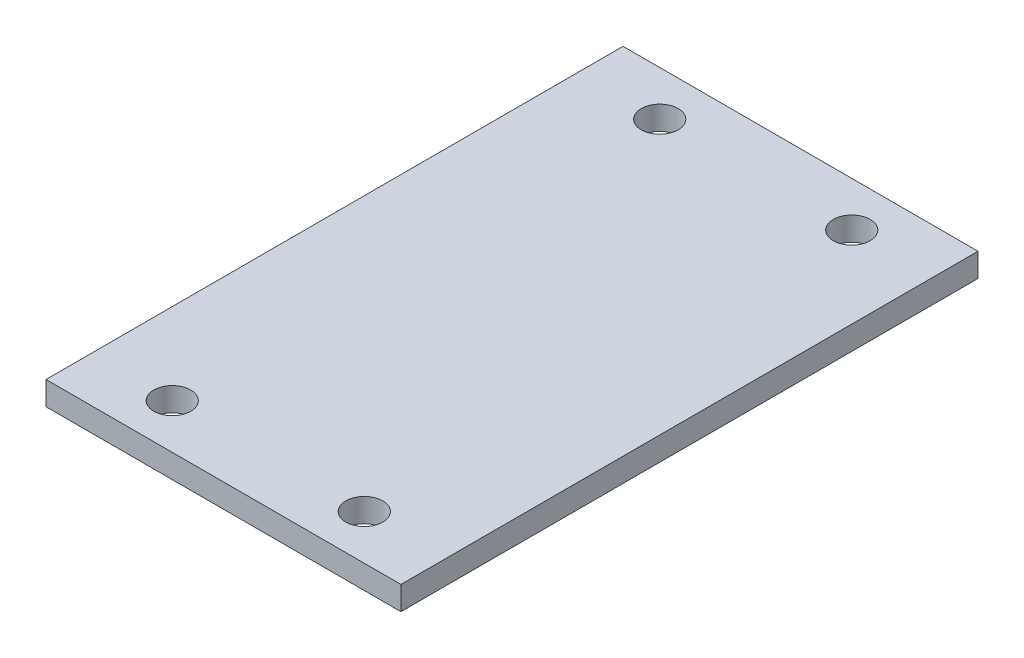
ISO-10303-21;
HEADER;
FILE_DESCRIPTION(('STEP AP214'),'2;1');
FILE_NAME('part.step','',(''),(''),'','','');
FILE_SCHEMA(('AUTOMOTIVE_DESIGN { 1 0 10303 214 1 1 1 1 }'));
ENDSEC;
DATA;
#1=APPLICATION_CONTEXT('core data for automotive mechanical design processes');
#2=APPLICATION_PROTOCOL_DEFINITION('international standard','automotive_design',2000,#1);
#3=PRODUCT_CONTEXT('',#1,'mechanical');
#4=PRODUCT('Part','Part','',(#3));
#5=PRODUCT_RELATED_PRODUCT_CATEGORY('part','',(#4));
#6=PRODUCT_DEFINITION_FORMATION('','',#4);
#7=PRODUCT_DEFINITION_CONTEXT('part definition',#1,'design');
#8=PRODUCT_DEFINITION('design','',#6,#7);
#9=PRODUCT_DEFINITION_SHAPE('','',#8);
#10=(LENGTH_UNIT() NAMED_UNIT(*) SI_UNIT(.MILLI.,.METRE.));
#11=(NAMED_UNIT(*) PLANE_ANGLE_UNIT() SI_UNIT($,.RADIAN.));
#12=(NAMED_UNIT(*) SI_UNIT($,.STERADIAN.) SOLID_ANGLE_UNIT());
#13=UNCERTAINTY_MEASURE_WITH_UNIT(LENGTH_MEASURE(1.E-05),#10,'distance_accuracy_value','');
#14=(GEOMETRIC_REPRESENTATION_CONTEXT(3) GLOBAL_UNCERTAINTY_ASSIGNED_CONTEXT((#13)) GLOBAL_UNIT_ASSIGNED_CONTEXT((#10,
#11,#12)) REPRESENTATION_CONTEXT('',''));
#15=CARTESIAN_POINT('',(0.,0.,0.));
#16=DIRECTION('',(0.,0.,1.));
#17=DIRECTION('',(1.,0.,0.));
#18=AXIS2_PLACEMENT_3D('',#15,#16,#17);
#19=CARTESIAN_POINT('',(0.,1.6,0.));
#20=DIRECTION('',(0.,-1.,0.));
#21=DIRECTION('',(0.,0.,-1.));
#22=AXIS2_PLACEMENT_3D('',#19,#20,#21);
#23=PLANE('',#22);
#24=DIRECTION('',(0.,0.,1.));
#25=VECTOR('',#24,1.);
#26=CARTESIAN_POINT('',(0.,1.6,0.));
#27=LINE('',#26,#25);
#28=CARTESIAN_POINT('',(0.,1.6,-39.0652));
#29=VERTEX_POINT('',#28);
#30=CARTESIAN_POINT('',(0.,1.6,0.));
#31=VERTEX_POINT('',#30);
#32=EDGE_CURVE('E88',#29,#31,#27,.T.);
#33=ORIENTED_EDGE('',*,*,#32,.T.);
#34=DIRECTION('',(1.,0.,0.));
#35=VECTOR('',#34,1.);
#36=CARTESIAN_POINT('',(0.,1.6,0.));
#37=LINE('',#36,#35);
#38=CARTESIAN_POINT('',(24.0284,1.6,0.));
#39=VERTEX_POINT('',#38);
#40=EDGE_CURVE('E83',#31,#39,#37,.T.);
#41=ORIENTED_EDGE('',*,*,#40,.T.);
#42=DIRECTION('',(0.,0.,-1.));
#43=VECTOR('',#42,1.);
#44=CARTESIAN_POINT('',(24.0284,1.6,0.));
#45=LINE('',#44,#43);
#46=CARTESIAN_POINT('',(24.0284,1.6,-39.0652));
#47=VERTEX_POINT('',#46);
#48=EDGE_CURVE('E86',#39,#47,#45,.T.);
#49=ORIENTED_EDGE('',*,*,#48,.T.);
#50=DIRECTION('',(-1.,0.,0.));
#51=VECTOR('',#50,1.);
#52=CARTESIAN_POINT('',(0.,1.6,-39.0652));
#53=LINE('',#52,#51);
#54=EDGE_CURVE('E53',#47,#29,#53,.T.);
#55=ORIENTED_EDGE('',*,*,#54,.T.);
#56=EDGE_LOOP('',(#33,#41,#49,#55));
#57=FACE_BOUND('',#56,.T.);
#58=CARTESIAN_POINT('',(5.51420000000001,1.6,-36.0326));
#59=DIRECTION('',(0.,1.,0.));
#60=DIRECTION('',(0.,0.,1.));
#61=AXIS2_PLACEMENT_3D('',#58,#59,#60);
#62=CIRCLE('',#61,1.25);
#63=CARTESIAN_POINT('',(5.51420000000001,1.6,-34.7826));
#64=VERTEX_POINT('',#63);
#65=EDGE_CURVE('E103',#64,#64,#62,.T.);
#66=ORIENTED_EDGE('',*,*,#65,.F.);
#67=EDGE_LOOP('',(#66));
#68=FACE_BOUND('',#67,.T.);
#69=CARTESIAN_POINT('',(5.5142,1.6,-3.0326));
#70=DIRECTION('',(0.,1.,0.));
#71=DIRECTION('',(0.,0.,1.));
#72=AXIS2_PLACEMENT_3D('',#69,#70,#71);
#73=CIRCLE('',#72,1.25);
#74=CARTESIAN_POINT('',(5.5142,1.6,-1.78260000000001));
#75=VERTEX_POINT('',#74);
#76=EDGE_CURVE('E118',#75,#75,#73,.T.);
#77=ORIENTED_EDGE('',*,*,#76,.F.);
#78=EDGE_LOOP('',(#77));
#79=FACE_BOUND('',#78,.T.);
#80=CARTESIAN_POINT('',(18.5142,1.6,-36.0326));
#81=DIRECTION('',(0.,1.,0.));
#82=DIRECTION('',(0.,0.,1.));
#83=AXIS2_PLACEMENT_3D('',#80,#81,#82);
#84=CIRCLE('',#83,1.25);
#85=CARTESIAN_POINT('',(18.5142,1.6,-34.7826));
#86=VERTEX_POINT('',#85);
#87=EDGE_CURVE('E124',#86,#86,#84,.T.);
#88=ORIENTED_EDGE('',*,*,#87,.F.);
#89=EDGE_LOOP('',(#88));
#90=FACE_BOUND('',#89,.T.);
#91=CARTESIAN_POINT('',(18.5142,1.6,-3.0326));
#92=DIRECTION('',(0.,1.,0.));
#93=DIRECTION('',(0.,0.,1.));
#94=AXIS2_PLACEMENT_3D('',#91,#92,#93);
#95=CIRCLE('',#94,1.25);
#96=CARTESIAN_POINT('',(18.5142,1.6,-1.7826));
#97=VERTEX_POINT('',#96);
#98=EDGE_CURVE('E130',#97,#97,#95,.T.);
#99=ORIENTED_EDGE('',*,*,#98,.F.);
#100=EDGE_LOOP('',(#99));
#101=FACE_BOUND('',#100,.T.);
#102=ADVANCED_FACE('F36',(#57,#68,#79,#90,#101),#23,.F.);
#103=CARTESIAN_POINT('',(0.,0.,0.));
#104=DIRECTION('',(0.,-1.,0.));
#105=DIRECTION('',(0.,0.,-1.));
#106=AXIS2_PLACEMENT_3D('',#103,#104,#105);
#107=PLANE('',#106);
#108=CARTESIAN_POINT('',(18.5142,0.,-36.0326));
#109=DIRECTION('',(0.,1.,0.));
#110=DIRECTION('',(0.,0.,1.));
#111=AXIS2_PLACEMENT_3D('',#108,#109,#110);
#112=CIRCLE('',#111,1.25);
#113=CARTESIAN_POINT('',(18.5142,0.,-34.7826));
#114=VERTEX_POINT('',#113);
#115=EDGE_CURVE('E127',#114,#114,#112,.T.);
#116=ORIENTED_EDGE('',*,*,#115,.T.);
#117=EDGE_LOOP('',(#116));
#118=FACE_BOUND('',#117,.T.);
#119=CARTESIAN_POINT('',(5.51420000000001,0.,-36.0326));
#120=DIRECTION('',(0.,1.,0.));
#121=DIRECTION('',(0.,0.,1.));
#122=AXIS2_PLACEMENT_3D('',#119,#120,#121);
#123=CIRCLE('',#122,1.25);
#124=CARTESIAN_POINT('',(5.51420000000001,0.,-34.7826));
#125=VERTEX_POINT('',#124);
#126=EDGE_CURVE('E115',#125,#125,#123,.T.);
#127=ORIENTED_EDGE('',*,*,#126,.T.);
#128=EDGE_LOOP('',(#127));
#129=FACE_BOUND('',#128,.T.);
#130=DIRECTION('',(0.,0.,1.));
#131=VECTOR('',#130,1.);
#132=CARTESIAN_POINT('',(0.,0.,0.));
#133=LINE('',#132,#131);
#134=CARTESIAN_POINT('',(0.,0.,-39.0652));
#135=VERTEX_POINT('',#134);
#136=CARTESIAN_POINT('',(0.,0.,0.));
#137=VERTEX_POINT('',#136);
#138=EDGE_CURVE('E100',#135,#137,#133,.T.);
#139=ORIENTED_EDGE('',*,*,#138,.F.);
#140=DIRECTION('',(-1.,0.,0.));
#141=VECTOR('',#140,1.);
#142=CARTESIAN_POINT('',(0.,0.,-39.0652));
#143=LINE('',#142,#141);
#144=CARTESIAN_POINT('',(24.0284,0.,-39.0652));
#145=VERTEX_POINT('',#144);
#146=EDGE_CURVE('E76',#145,#135,#143,.T.);
#147=ORIENTED_EDGE('',*,*,#146,.F.);
#148=DIRECTION('',(0.,0.,-1.));
#149=VECTOR('',#148,1.);
#150=CARTESIAN_POINT('',(24.0284,0.,0.));
#151=LINE('',#150,#149);
#152=CARTESIAN_POINT('',(24.0284,0.,0.));
#153=VERTEX_POINT('',#152);
#154=EDGE_CURVE('E70',#153,#145,#151,.T.);
#155=ORIENTED_EDGE('',*,*,#154,.F.);
#156=DIRECTION('',(1.,0.,0.));
#157=VECTOR('',#156,1.);
#158=CARTESIAN_POINT('',(0.,0.,0.));
#159=LINE('',#158,#157);
#160=EDGE_CURVE('E92',#137,#153,#159,.T.);
#161=ORIENTED_EDGE('',*,*,#160,.F.);
#162=EDGE_LOOP('',(#139,#147,#155,#161));
#163=FACE_BOUND('',#162,.T.);
#164=CARTESIAN_POINT('',(5.5142,0.,-3.0326));
#165=DIRECTION('',(0.,1.,0.));
#166=DIRECTION('',(0.,0.,1.));
#167=AXIS2_PLACEMENT_3D('',#164,#165,#166);
#168=CIRCLE('',#167,1.25);
#169=CARTESIAN_POINT('',(5.5142,0.,-1.78260000000001));
#170=VERTEX_POINT('',#169);
#171=EDGE_CURVE('E121',#170,#170,#168,.T.);
#172=ORIENTED_EDGE('',*,*,#171,.T.);
#173=EDGE_LOOP('',(#172));
#174=FACE_BOUND('',#173,.T.);
#175=CARTESIAN_POINT('',(18.5142,0.,-3.0326));
#176=DIRECTION('',(0.,1.,0.));
#177=DIRECTION('',(0.,0.,1.));
#178=AXIS2_PLACEMENT_3D('',#175,#176,#177);
#179=CIRCLE('',#178,1.25);
#180=CARTESIAN_POINT('',(18.5142,0.,-1.7826));
#181=VERTEX_POINT('',#180);
#182=EDGE_CURVE('E133',#181,#181,#179,.T.);
#183=ORIENTED_EDGE('',*,*,#182,.T.);
#184=EDGE_LOOP('',(#183));
#185=FACE_BOUND('',#184,.T.);
#186=ADVANCED_FACE('F111',(#118,#129,#163,#174,#185),#107,.T.);
#187=CARTESIAN_POINT('',(0.,1.6,0.));
#188=DIRECTION('',(1.,0.,0.));
#189=DIRECTION('',(0.,0.,-1.));
#190=AXIS2_PLACEMENT_3D('',#187,#188,#189);
#191=PLANE('',#190);
#192=ORIENTED_EDGE('',*,*,#138,.T.);
#193=DIRECTION('',(0.,-1.,0.));
#194=VECTOR('',#193,1.);
#195=CARTESIAN_POINT('',(0.,1.6,0.));
#196=LINE('',#195,#194);
#197=EDGE_CURVE('E11',#31,#137,#196,.T.);
#198=ORIENTED_EDGE('',*,*,#197,.F.);
#199=ORIENTED_EDGE('',*,*,#32,.F.);
#200=DIRECTION('',(0.,-1.,0.));
#201=VECTOR('',#200,1.);
#202=CARTESIAN_POINT('',(0.,1.6,-39.0652));
#203=LINE('',#202,#201);
#204=EDGE_CURVE('E96',#29,#135,#203,.T.);
#205=ORIENTED_EDGE('',*,*,#204,.T.);
#206=EDGE_LOOP('',(#192,#198,#199,#205));
#207=FACE_BOUND('',#206,.T.);
#208=ADVANCED_FACE('F38',(#207),#191,.F.);
#209=CARTESIAN_POINT('',(0.,1.6,0.));
#210=DIRECTION('',(0.,0.,-1.));
#211=DIRECTION('',(-1.,0.,0.));
#212=AXIS2_PLACEMENT_3D('',#209,#210,#211);
#213=PLANE('',#212);
#214=ORIENTED_EDGE('',*,*,#160,.T.);
#215=DIRECTION('',(0.,-1.,0.));
#216=VECTOR('',#215,1.);
#217=CARTESIAN_POINT('',(24.0284,1.6,0.));
#218=LINE('',#217,#216);
#219=EDGE_CURVE('E45',#39,#153,#218,.T.);
#220=ORIENTED_EDGE('',*,*,#219,.F.);
#221=ORIENTED_EDGE('',*,*,#40,.F.);
#222=ORIENTED_EDGE('',*,*,#197,.T.);
#223=EDGE_LOOP('',(#214,#220,#221,#222));
#224=FACE_BOUND('',#223,.T.);
#225=ADVANCED_FACE('F91',(#224),#213,.F.);
#226=CARTESIAN_POINT('',(24.0284,1.6,0.));
#227=DIRECTION('',(-1.,0.,0.));
#228=DIRECTION('',(0.,0.,1.));
#229=AXIS2_PLACEMENT_3D('',#226,#227,#228);
#230=PLANE('',#229);
#231=ORIENTED_EDGE('',*,*,#154,.T.);
#232=DIRECTION('',(0.,-1.,0.));
#233=VECTOR('',#232,1.);
#234=CARTESIAN_POINT('',(24.0284,1.6,-39.0652));
#235=LINE('',#234,#233);
#236=EDGE_CURVE('E93',#47,#145,#235,.T.);
#237=ORIENTED_EDGE('',*,*,#236,.F.);
#238=ORIENTED_EDGE('',*,*,#48,.F.);
#239=ORIENTED_EDGE('',*,*,#219,.T.);
#240=EDGE_LOOP('',(#231,#237,#238,#239));
#241=FACE_BOUND('',#240,.T.);
#242=ADVANCED_FACE('F94',(#241),#230,.F.);
#243=CARTESIAN_POINT('',(0.,1.6,-39.0652));
#244=DIRECTION('',(0.,0.,1.));
#245=DIRECTION('',(1.,0.,0.));
#246=AXIS2_PLACEMENT_3D('',#243,#244,#245);
#247=PLANE('',#246);
#248=ORIENTED_EDGE('',*,*,#146,.T.);
#249=ORIENTED_EDGE('',*,*,#204,.F.);
#250=ORIENTED_EDGE('',*,*,#54,.F.);
#251=ORIENTED_EDGE('',*,*,#236,.T.);
#252=EDGE_LOOP('',(#248,#249,#250,#251));
#253=FACE_BOUND('',#252,.T.);
#254=ADVANCED_FACE('F108',(#253),#247,.F.);
#255=CARTESIAN_POINT('',(5.51420000000001,1.6,-36.0326));
#256=DIRECTION('',(0.,-1.,0.));
#257=DIRECTION('',(0.,0.,-1.));
#258=AXIS2_PLACEMENT_3D('',#255,#256,#257);
#259=CYLINDRICAL_SURFACE('',#258,1.25);
#260=ORIENTED_EDGE('',*,*,#65,.T.);
#261=EDGE_LOOP('',(#260));
#262=FACE_BOUND('',#261,.T.);
#263=ORIENTED_EDGE('',*,*,#126,.F.);
#264=EDGE_LOOP('',(#263));
#265=FACE_BOUND('',#264,.T.);
#266=ADVANCED_FACE('F150',(#262,#265),#259,.F.);
#267=CARTESIAN_POINT('',(5.5142,1.6,-3.0326));
#268=DIRECTION('',(0.,-1.,0.));
#269=DIRECTION('',(0.,0.,-1.));
#270=AXIS2_PLACEMENT_3D('',#267,#268,#269);
#271=CYLINDRICAL_SURFACE('',#270,1.25);
#272=ORIENTED_EDGE('',*,*,#76,.T.);
#273=EDGE_LOOP('',(#272));
#274=FACE_BOUND('',#273,.T.);
#275=ORIENTED_EDGE('',*,*,#171,.F.);
#276=EDGE_LOOP('',(#275));
#277=FACE_BOUND('',#276,.T.);
#278=ADVANCED_FACE('F205',(#274,#277),#271,.F.);
#279=CARTESIAN_POINT('',(18.5142,1.6,-36.0326));
#280=DIRECTION('',(0.,-1.,0.));
#281=DIRECTION('',(0.,0.,-1.));
#282=AXIS2_PLACEMENT_3D('',#279,#280,#281);
#283=CYLINDRICAL_SURFACE('',#282,1.25);
#284=ORIENTED_EDGE('',*,*,#87,.T.);
#285=EDGE_LOOP('',(#284));
#286=FACE_BOUND('',#285,.T.);
#287=ORIENTED_EDGE('',*,*,#115,.F.);
#288=EDGE_LOOP('',(#287));
#289=FACE_BOUND('',#288,.T.);
#290=ADVANCED_FACE('F214',(#286,#289),#283,.F.);
#291=CARTESIAN_POINT('',(18.5142,1.6,-3.0326));
#292=DIRECTION('',(0.,-1.,0.));
#293=DIRECTION('',(0.,0.,-1.));
#294=AXIS2_PLACEMENT_3D('',#291,#292,#293);
#295=CYLINDRICAL_SURFACE('',#294,1.25);
#296=ORIENTED_EDGE('',*,*,#98,.T.);
#297=EDGE_LOOP('',(#296));
#298=FACE_BOUND('',#297,.T.);
#299=ORIENTED_EDGE('',*,*,#182,.F.);
#300=EDGE_LOOP('',(#299));
#301=FACE_BOUND('',#300,.T.);
#302=ADVANCED_FACE('F139',(#298,#301),#295,.F.);
#303=CLOSED_SHELL('',(#102,#186,#208,#225,#242,#254,#266,#278,#290,#302));
#304=MANIFOLD_SOLID_BREP('B2',#303);
#305=ADVANCED_BREP_SHAPE_REPRESENTATION('',(#18,#304),#14);
#306=SHAPE_DEFINITION_REPRESENTATION(#9,#305);
ENDSEC;
END-ISO-10303-21;
